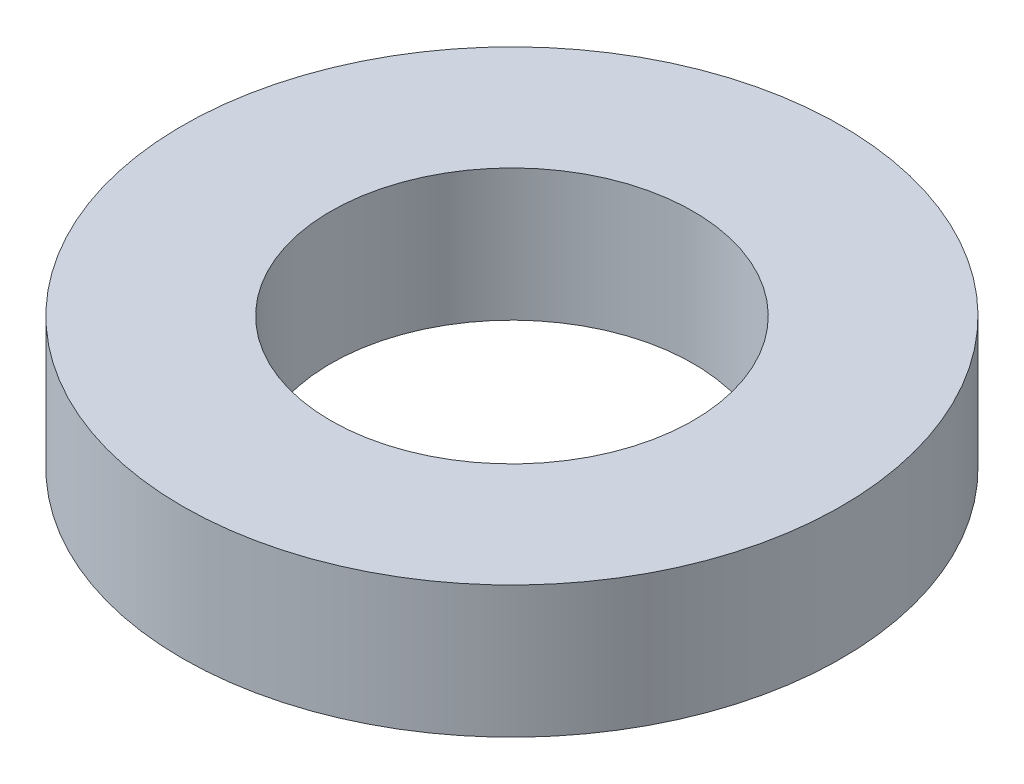
ISO-10303-21;
HEADER;
FILE_DESCRIPTION(('STEP AP214'),'2;1');
FILE_NAME('part.step','',(''),(''),'','','');
FILE_SCHEMA(('AUTOMOTIVE_DESIGN { 1 0 10303 214 1 1 1 1 }'));
ENDSEC;
DATA;
#1=APPLICATION_CONTEXT('core data for automotive mechanical design processes');
#2=APPLICATION_PROTOCOL_DEFINITION('international standard','automotive_design',2000,#1);
#3=PRODUCT_CONTEXT('',#1,'mechanical');
#4=PRODUCT('Part','Part','',(#3));
#5=PRODUCT_RELATED_PRODUCT_CATEGORY('part','',(#4));
#6=PRODUCT_DEFINITION_FORMATION('','',#4);
#7=PRODUCT_DEFINITION_CONTEXT('part definition',#1,'design');
#8=PRODUCT_DEFINITION('design','',#6,#7);
#9=PRODUCT_DEFINITION_SHAPE('','',#8);
#10=(LENGTH_UNIT() NAMED_UNIT(*) SI_UNIT(.MILLI.,.METRE.));
#11=(NAMED_UNIT(*) PLANE_ANGLE_UNIT() SI_UNIT($,.RADIAN.));
#12=(NAMED_UNIT(*) SI_UNIT($,.STERADIAN.) SOLID_ANGLE_UNIT());
#13=UNCERTAINTY_MEASURE_WITH_UNIT(LENGTH_MEASURE(1.E-05),#10,'distance_accuracy_value','');
#14=(GEOMETRIC_REPRESENTATION_CONTEXT(3) GLOBAL_UNCERTAINTY_ASSIGNED_CONTEXT((#13)) GLOBAL_UNIT_ASSIGNED_CONTEXT((#10,
#11,#12)) REPRESENTATION_CONTEXT('',''));
#15=CARTESIAN_POINT('',(0.,0.,0.));
#16=DIRECTION('',(0.,0.,1.));
#17=DIRECTION('',(1.,0.,0.));
#18=AXIS2_PLACEMENT_3D('',#15,#16,#17);
#19=CARTESIAN_POINT('',(0.,-1.,0.));
#20=DIRECTION('',(0.,1.,0.));
#21=DIRECTION('',(0.,0.,1.));
#22=AXIS2_PLACEMENT_3D('',#19,#20,#21);
#23=CYLINDRICAL_SURFACE('',#22,2.75);
#24=CARTESIAN_POINT('',(0.,2.,0.));
#25=DIRECTION('',(0.,1.,0.));
#26=DIRECTION('',(0.,0.,1.));
#27=AXIS2_PLACEMENT_3D('',#24,#25,#26);
#28=CIRCLE('',#27,2.75);
#29=CARTESIAN_POINT('',(0.,2.,2.75));
#30=VERTEX_POINT('',#29);
#31=EDGE_CURVE('E21',#30,#30,#28,.T.);
#32=ORIENTED_EDGE('',*,*,#31,.T.);
#33=EDGE_LOOP('',(#32));
#34=FACE_BOUND('',#33,.T.);
#35=CARTESIAN_POINT('',(0.,0.,0.));
#36=DIRECTION('',(0.,1.,0.));
#37=DIRECTION('',(0.,0.,1.));
#38=AXIS2_PLACEMENT_3D('',#35,#36,#37);
#39=CIRCLE('',#38,2.75);
#40=CARTESIAN_POINT('',(0.,0.,2.75));
#41=VERTEX_POINT('',#40);
#42=EDGE_CURVE('E9',#41,#41,#39,.T.);
#43=ORIENTED_EDGE('',*,*,#42,.F.);
#44=EDGE_LOOP('',(#43));
#45=FACE_BOUND('',#44,.T.);
#46=ADVANCED_FACE('F14',(#34,#45),#23,.F.);
#47=CARTESIAN_POINT('',(0.,0.,0.));
#48=DIRECTION('',(0.,1.,0.));
#49=DIRECTION('',(1.,0.,0.));
#50=AXIS2_PLACEMENT_3D('',#47,#48,#49);
#51=PLANE('',#50);
#52=ORIENTED_EDGE('',*,*,#42,.T.);
#53=EDGE_LOOP('',(#52));
#54=FACE_BOUND('',#53,.T.);
#55=CARTESIAN_POINT('',(0.,0.,0.));
#56=DIRECTION('',(0.,1.,0.));
#57=DIRECTION('',(0.,0.,1.));
#58=AXIS2_PLACEMENT_3D('',#55,#56,#57);
#59=CIRCLE('',#58,5.);
#60=CARTESIAN_POINT('',(0.,0.,5.));
#61=VERTEX_POINT('',#60);
#62=EDGE_CURVE('E29',#61,#61,#59,.T.);
#63=ORIENTED_EDGE('',*,*,#62,.F.);
#64=EDGE_LOOP('',(#63));
#65=FACE_BOUND('',#64,.T.);
#66=ADVANCED_FACE('F51',(#54,#65),#51,.F.);
#67=CARTESIAN_POINT('',(0.,2.,0.));
#68=DIRECTION('',(0.,1.,0.));
#69=DIRECTION('',(1.,0.,0.));
#70=AXIS2_PLACEMENT_3D('',#67,#68,#69);
#71=PLANE('',#70);
#72=ORIENTED_EDGE('',*,*,#31,.F.);
#73=EDGE_LOOP('',(#72));
#74=FACE_BOUND('',#73,.T.);
#75=CARTESIAN_POINT('',(0.,2.,0.));
#76=DIRECTION('',(0.,1.,0.));
#77=DIRECTION('',(0.,0.,1.));
#78=AXIS2_PLACEMENT_3D('',#75,#76,#77);
#79=CIRCLE('',#78,5.);
#80=CARTESIAN_POINT('',(0.,2.,5.));
#81=VERTEX_POINT('',#80);
#82=EDGE_CURVE('E35',#81,#81,#79,.T.);
#83=ORIENTED_EDGE('',*,*,#82,.T.);
#84=EDGE_LOOP('',(#83));
#85=FACE_BOUND('',#84,.T.);
#86=ADVANCED_FACE('F43',(#74,#85),#71,.T.);
#87=CARTESIAN_POINT('',(0.,0.,0.));
#88=DIRECTION('',(0.,1.,0.));
#89=DIRECTION('',(0.,0.,1.));
#90=AXIS2_PLACEMENT_3D('',#87,#88,#89);
#91=CYLINDRICAL_SURFACE('',#90,5.);
#92=ORIENTED_EDGE('',*,*,#82,.F.);
#93=EDGE_LOOP('',(#92));
#94=FACE_BOUND('',#93,.T.);
#95=ORIENTED_EDGE('',*,*,#62,.T.);
#96=EDGE_LOOP('',(#95));
#97=FACE_BOUND('',#96,.T.);
#98=ADVANCED_FACE('F45',(#94,#97),#91,.T.);
#99=CLOSED_SHELL('',(#46,#66,#86,#98));
#100=MANIFOLD_SOLID_BREP('B1',#99);
#101=ADVANCED_BREP_SHAPE_REPRESENTATION('',(#18,#100),#14);
#102=SHAPE_DEFINITION_REPRESENTATION(#9,#101);
ENDSEC;
END-ISO-10303-21;
